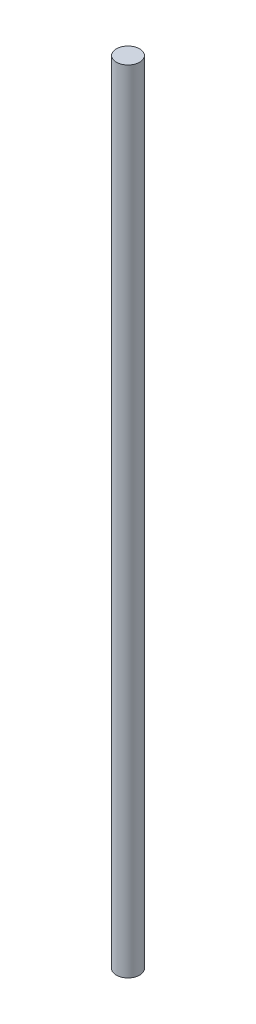
ISO-10303-21;
HEADER;
FILE_DESCRIPTION(('STEP AP214'),'2;1');
FILE_NAME('part.step','',(''),(''),'','','');
FILE_SCHEMA(('AUTOMOTIVE_DESIGN { 1 0 10303 214 1 1 1 1 }'));
ENDSEC;
DATA;
#1=APPLICATION_CONTEXT('core data for automotive mechanical design processes');
#2=APPLICATION_PROTOCOL_DEFINITION('international standard','automotive_design',2000,#1);
#3=PRODUCT_CONTEXT('',#1,'mechanical');
#4=PRODUCT('Part','Part','',(#3));
#5=PRODUCT_RELATED_PRODUCT_CATEGORY('part','',(#4));
#6=PRODUCT_DEFINITION_FORMATION('','',#4);
#7=PRODUCT_DEFINITION_CONTEXT('part definition',#1,'design');
#8=PRODUCT_DEFINITION('design','',#6,#7);
#9=PRODUCT_DEFINITION_SHAPE('','',#8);
#10=(LENGTH_UNIT() NAMED_UNIT(*) SI_UNIT(.MILLI.,.METRE.));
#11=(NAMED_UNIT(*) PLANE_ANGLE_UNIT() SI_UNIT($,.RADIAN.));
#12=(NAMED_UNIT(*) SI_UNIT($,.STERADIAN.) SOLID_ANGLE_UNIT());
#13=UNCERTAINTY_MEASURE_WITH_UNIT(LENGTH_MEASURE(1.E-05),#10,'distance_accuracy_value','');
#14=(GEOMETRIC_REPRESENTATION_CONTEXT(3) GLOBAL_UNCERTAINTY_ASSIGNED_CONTEXT((#13)) GLOBAL_UNIT_ASSIGNED_CONTEXT((#10,
#11,#12)) REPRESENTATION_CONTEXT('',''));
#15=CARTESIAN_POINT('',(0.,0.,0.));
#16=DIRECTION('',(0.,0.,1.));
#17=DIRECTION('',(1.,0.,0.));
#18=AXIS2_PLACEMENT_3D('',#15,#16,#17);
#19=CARTESIAN_POINT('',(-10.3411432577351,170.,-6.94795562629076));
#20=DIRECTION('',(0.,-1.,0.));
#21=DIRECTION('',(0.,0.,-1.));
#22=AXIS2_PLACEMENT_3D('',#19,#20,#21);
#23=CYLINDRICAL_SURFACE('',#22,2.5);
#24=CARTESIAN_POINT('',(-10.3411432577351,170.,-6.94795562629076));
#25=DIRECTION('',(0.,1.,0.));
#26=DIRECTION('',(0.,0.,1.));
#27=AXIS2_PLACEMENT_3D('',#24,#25,#26);
#28=CIRCLE('',#27,2.5);
#29=CARTESIAN_POINT('',(-10.3411432577351,170.,-4.44795562629076));
#30=VERTEX_POINT('',#29);
#31=EDGE_CURVE('E10',#30,#30,#28,.T.);
#32=ORIENTED_EDGE('',*,*,#31,.F.);
#33=EDGE_LOOP('',(#32));
#34=FACE_BOUND('',#33,.T.);
#35=CARTESIAN_POINT('',(-10.3411432577351,0.,-6.94795562629076));
#36=DIRECTION('',(0.,1.,0.));
#37=DIRECTION('',(0.,0.,1.));
#38=AXIS2_PLACEMENT_3D('',#35,#36,#37);
#39=CIRCLE('',#38,2.5);
#40=CARTESIAN_POINT('',(-10.3411432577351,0.,-4.44795562629076));
#41=VERTEX_POINT('',#40);
#42=EDGE_CURVE('E36',#41,#41,#39,.T.);
#43=ORIENTED_EDGE('',*,*,#42,.T.);
#44=EDGE_LOOP('',(#43));
#45=FACE_BOUND('',#44,.T.);
#46=ADVANCED_FACE('F33',(#34,#45),#23,.T.);
#47=CARTESIAN_POINT('',(-10.3411432577351,170.,-6.94795562629076));
#48=DIRECTION('',(0.,1.,0.));
#49=DIRECTION('',(0.,0.,1.));
#50=AXIS2_PLACEMENT_3D('',#47,#48,#49);
#51=PLANE('',#50);
#52=ORIENTED_EDGE('',*,*,#31,.T.);
#53=EDGE_LOOP('',(#52));
#54=FACE_BOUND('',#53,.T.);
#55=ADVANCED_FACE('F48',(#54),#51,.T.);
#56=CARTESIAN_POINT('',(-10.3411432577351,0.,-6.94795562629076));
#57=DIRECTION('',(0.,1.,0.));
#58=DIRECTION('',(0.,0.,1.));
#59=AXIS2_PLACEMENT_3D('',#56,#57,#58);
#60=PLANE('',#59);
#61=ORIENTED_EDGE('',*,*,#42,.F.);
#62=EDGE_LOOP('',(#61));
#63=FACE_BOUND('',#62,.T.);
#64=ADVANCED_FACE('F46',(#63),#60,.F.);
#65=CLOSED_SHELL('',(#46,#55,#64));
#66=MANIFOLD_SOLID_BREP('B2',#65);
#67=ADVANCED_BREP_SHAPE_REPRESENTATION('',(#18,#66),#14);
#68=SHAPE_DEFINITION_REPRESENTATION(#9,#67);
ENDSEC;
END-ISO-10303-21;
